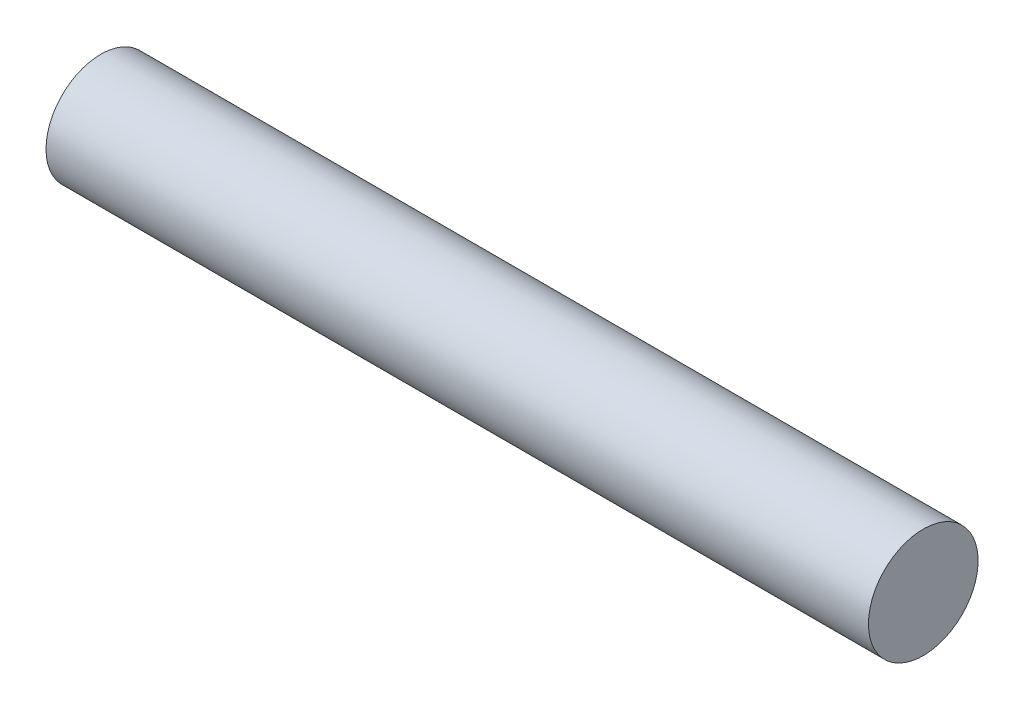
ISO-10303-21;
HEADER;
FILE_DESCRIPTION(('STEP AP214'),'2;1');
FILE_NAME('part.step','',(''),(''),'','','');
FILE_SCHEMA(('AUTOMOTIVE_DESIGN { 1 0 10303 214 1 1 1 1 }'));
ENDSEC;
DATA;
#1=APPLICATION_CONTEXT('core data for automotive mechanical design processes');
#2=APPLICATION_PROTOCOL_DEFINITION('international standard','automotive_design',2000,#1);
#3=PRODUCT_CONTEXT('',#1,'mechanical');
#4=PRODUCT('Part','Part','',(#3));
#5=PRODUCT_RELATED_PRODUCT_CATEGORY('part','',(#4));
#6=PRODUCT_DEFINITION_FORMATION('','',#4);
#7=PRODUCT_DEFINITION_CONTEXT('part definition',#1,'design');
#8=PRODUCT_DEFINITION('design','',#6,#7);
#9=PRODUCT_DEFINITION_SHAPE('','',#8);
#10=(LENGTH_UNIT() NAMED_UNIT(*) SI_UNIT(.MILLI.,.METRE.));
#11=(NAMED_UNIT(*) PLANE_ANGLE_UNIT() SI_UNIT($,.RADIAN.));
#12=(NAMED_UNIT(*) SI_UNIT($,.STERADIAN.) SOLID_ANGLE_UNIT());
#13=UNCERTAINTY_MEASURE_WITH_UNIT(LENGTH_MEASURE(1.E-05),#10,'distance_accuracy_value','');
#14=(GEOMETRIC_REPRESENTATION_CONTEXT(3) GLOBAL_UNCERTAINTY_ASSIGNED_CONTEXT((#13)) GLOBAL_UNIT_ASSIGNED_CONTEXT((#10,
#11,#12)) REPRESENTATION_CONTEXT('',''));
#15=CARTESIAN_POINT('',(0.,0.,0.));
#16=DIRECTION('',(0.,0.,1.));
#17=DIRECTION('',(1.,0.,0.));
#18=AXIS2_PLACEMENT_3D('',#15,#16,#17);
#19=CARTESIAN_POINT('',(-75.,0.,-5.));
#20=DIRECTION('',(1.,0.,0.));
#21=DIRECTION('',(0.,0.,-1.));
#22=AXIS2_PLACEMENT_3D('',#19,#20,#21);
#23=PLANE('',#22);
#24=CARTESIAN_POINT('',(-75.,0.,5.));
#25=DIRECTION('',(-1.,0.,0.));
#26=DIRECTION('',(0.,0.,1.));
#27=AXIS2_PLACEMENT_3D('',#24,#25,#26);
#28=CIRCLE('',#27,10.);
#29=CARTESIAN_POINT('',(-75.,0.,15.));
#30=VERTEX_POINT('',#29);
#31=EDGE_CURVE('E44',#30,#30,#28,.T.);
#32=ORIENTED_EDGE('',*,*,#31,.T.);
#33=EDGE_LOOP('',(#32));
#34=FACE_BOUND('',#33,.T.);
#35=ADVANCED_FACE('F37',(#34),#23,.F.);
#36=CARTESIAN_POINT('',(75.,0.,-5.));
#37=DIRECTION('',(-1.,0.,0.));
#38=DIRECTION('',(0.,0.,1.));
#39=AXIS2_PLACEMENT_3D('',#36,#37,#38);
#40=PLANE('',#39);
#41=CARTESIAN_POINT('',(75.,0.,5.));
#42=DIRECTION('',(-1.,0.,0.));
#43=DIRECTION('',(0.,0.,1.));
#44=AXIS2_PLACEMENT_3D('',#41,#42,#43);
#45=CIRCLE('',#44,10.);
#46=CARTESIAN_POINT('',(75.,0.,15.));
#47=VERTEX_POINT('',#46);
#48=EDGE_CURVE('E10',#47,#47,#45,.T.);
#49=ORIENTED_EDGE('',*,*,#48,.F.);
#50=EDGE_LOOP('',(#49));
#51=FACE_BOUND('',#50,.T.);
#52=ADVANCED_FACE('F54',(#51),#40,.F.);
#53=CARTESIAN_POINT('',(-75.,0.,5.));
#54=DIRECTION('',(-1.,0.,0.));
#55=DIRECTION('',(0.,0.,1.));
#56=AXIS2_PLACEMENT_3D('',#53,#54,#55);
#57=CYLINDRICAL_SURFACE('',#56,10.);
#58=ORIENTED_EDGE('',*,*,#31,.F.);
#59=EDGE_LOOP('',(#58));
#60=FACE_BOUND('',#59,.T.);
#61=ORIENTED_EDGE('',*,*,#48,.T.);
#62=EDGE_LOOP('',(#61));
#63=FACE_BOUND('',#62,.T.);
#64=ADVANCED_FACE('F52',(#60,#63),#57,.T.);
#65=CLOSED_SHELL('',(#35,#52,#64));
#66=MANIFOLD_SOLID_BREP('B2',#65);
#67=ADVANCED_BREP_SHAPE_REPRESENTATION('',(#18,#66),#14);
#68=SHAPE_DEFINITION_REPRESENTATION(#9,#67);
ENDSEC;
END-ISO-10303-21;
